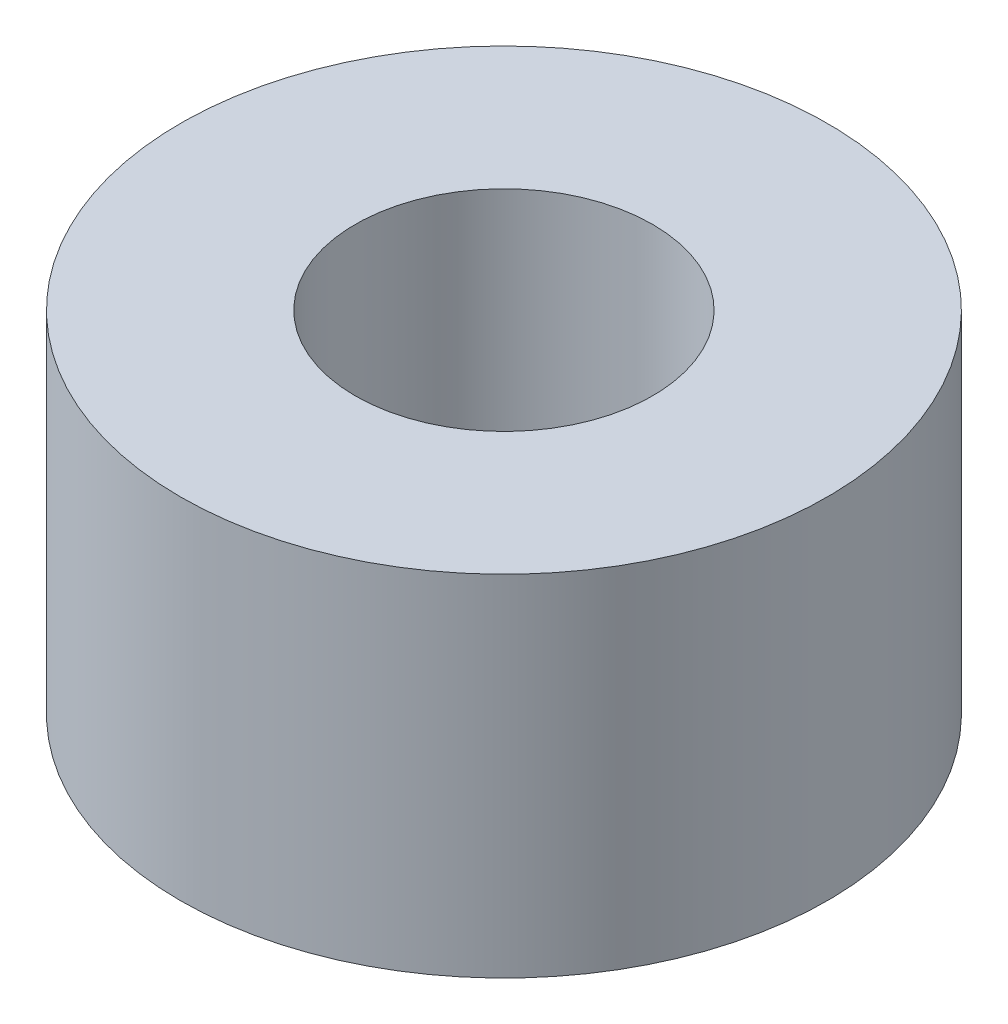
ISO-10303-21;
HEADER;
FILE_DESCRIPTION(('STEP AP214'),'2;1');
FILE_NAME('part.step','',(''),(''),'','','');
FILE_SCHEMA(('AUTOMOTIVE_DESIGN { 1 0 10303 214 1 1 1 1 }'));
ENDSEC;
DATA;
#1=APPLICATION_CONTEXT('core data for automotive mechanical design processes');
#2=APPLICATION_PROTOCOL_DEFINITION('international standard','automotive_design',2000,#1);
#3=PRODUCT_CONTEXT('',#1,'mechanical');
#4=PRODUCT('Part','Part','',(#3));
#5=PRODUCT_RELATED_PRODUCT_CATEGORY('part','',(#4));
#6=PRODUCT_DEFINITION_FORMATION('','',#4);
#7=PRODUCT_DEFINITION_CONTEXT('part definition',#1,'design');
#8=PRODUCT_DEFINITION('design','',#6,#7);
#9=PRODUCT_DEFINITION_SHAPE('','',#8);
#10=(LENGTH_UNIT() NAMED_UNIT(*) SI_UNIT(.MILLI.,.METRE.));
#11=(NAMED_UNIT(*) PLANE_ANGLE_UNIT() SI_UNIT($,.RADIAN.));
#12=(NAMED_UNIT(*) SI_UNIT($,.STERADIAN.) SOLID_ANGLE_UNIT());
#13=UNCERTAINTY_MEASURE_WITH_UNIT(LENGTH_MEASURE(1.E-05),#10,'distance_accuracy_value','');
#14=(GEOMETRIC_REPRESENTATION_CONTEXT(3) GLOBAL_UNCERTAINTY_ASSIGNED_CONTEXT((#13)) GLOBAL_UNIT_ASSIGNED_CONTEXT((#10,
#11,#12)) REPRESENTATION_CONTEXT('',''));
#15=CARTESIAN_POINT('',(0.,0.,0.));
#16=DIRECTION('',(0.,0.,1.));
#17=DIRECTION('',(1.,0.,0.));
#18=AXIS2_PLACEMENT_3D('',#15,#16,#17);
#19=CARTESIAN_POINT('',(0.,5.08,0.));
#20=DIRECTION('',(0.,1.,0.));
#21=DIRECTION('',(0.,0.,1.));
#22=AXIS2_PLACEMENT_3D('',#19,#20,#21);
#23=PLANE('',#22);
#24=CARTESIAN_POINT('',(0.,5.08,0.));
#25=DIRECTION('',(0.,1.,0.));
#26=DIRECTION('',(0.,0.,1.));
#27=AXIS2_PLACEMENT_3D('',#24,#25,#26);
#28=CIRCLE('',#27,4.699);
#29=CARTESIAN_POINT('',(0.,5.08,4.699));
#30=VERTEX_POINT('',#29);
#31=EDGE_CURVE('E10',#30,#30,#28,.T.);
#32=ORIENTED_EDGE('',*,*,#31,.T.);
#33=EDGE_LOOP('',(#32));
#34=FACE_BOUND('',#33,.T.);
#35=CARTESIAN_POINT('',(0.,5.08,0.));
#36=DIRECTION('',(0.,1.,0.));
#37=DIRECTION('',(0.,0.,1.));
#38=AXIS2_PLACEMENT_3D('',#35,#36,#37);
#39=CIRCLE('',#38,2.159);
#40=CARTESIAN_POINT('',(0.,5.08,2.159));
#41=VERTEX_POINT('',#40);
#42=EDGE_CURVE('E45',#41,#41,#39,.T.);
#43=ORIENTED_EDGE('',*,*,#42,.F.);
#44=EDGE_LOOP('',(#43));
#45=FACE_BOUND('',#44,.T.);
#46=ADVANCED_FACE('F34',(#34,#45),#23,.T.);
#47=CARTESIAN_POINT('',(0.,0.,0.));
#48=DIRECTION('',(0.,1.,0.));
#49=DIRECTION('',(0.,0.,1.));
#50=AXIS2_PLACEMENT_3D('',#47,#48,#49);
#51=PLANE('',#50);
#52=CARTESIAN_POINT('',(0.,0.,0.));
#53=DIRECTION('',(0.,1.,0.));
#54=DIRECTION('',(0.,0.,1.));
#55=AXIS2_PLACEMENT_3D('',#52,#53,#54);
#56=CIRCLE('',#55,4.699);
#57=CARTESIAN_POINT('',(0.,0.,4.699));
#58=VERTEX_POINT('',#57);
#59=EDGE_CURVE('E38',#58,#58,#56,.T.);
#60=ORIENTED_EDGE('',*,*,#59,.F.);
#61=EDGE_LOOP('',(#60));
#62=FACE_BOUND('',#61,.T.);
#63=CARTESIAN_POINT('',(0.,0.,0.));
#64=DIRECTION('',(0.,1.,0.));
#65=DIRECTION('',(0.,0.,1.));
#66=AXIS2_PLACEMENT_3D('',#63,#64,#65);
#67=CIRCLE('',#66,2.159);
#68=CARTESIAN_POINT('',(0.,0.,2.159));
#69=VERTEX_POINT('',#68);
#70=EDGE_CURVE('E47',#69,#69,#67,.T.);
#71=ORIENTED_EDGE('',*,*,#70,.T.);
#72=EDGE_LOOP('',(#71));
#73=FACE_BOUND('',#72,.T.);
#74=ADVANCED_FACE('F57',(#62,#73),#51,.F.);
#75=CARTESIAN_POINT('',(0.,5.08,0.));
#76=DIRECTION('',(0.,-1.,0.));
#77=DIRECTION('',(0.,0.,-1.));
#78=AXIS2_PLACEMENT_3D('',#75,#76,#77);
#79=CYLINDRICAL_SURFACE('',#78,4.699);
#80=ORIENTED_EDGE('',*,*,#31,.F.);
#81=EDGE_LOOP('',(#80));
#82=FACE_BOUND('',#81,.T.);
#83=ORIENTED_EDGE('',*,*,#59,.T.);
#84=EDGE_LOOP('',(#83));
#85=FACE_BOUND('',#84,.T.);
#86=ADVANCED_FACE('F36',(#82,#85),#79,.T.);
#87=CARTESIAN_POINT('',(0.,5.08,0.));
#88=DIRECTION('',(0.,-1.,0.));
#89=DIRECTION('',(0.,0.,-1.));
#90=AXIS2_PLACEMENT_3D('',#87,#88,#89);
#91=CYLINDRICAL_SURFACE('',#90,2.159);
#92=ORIENTED_EDGE('',*,*,#42,.T.);
#93=EDGE_LOOP('',(#92));
#94=FACE_BOUND('',#93,.T.);
#95=ORIENTED_EDGE('',*,*,#70,.F.);
#96=EDGE_LOOP('',(#95));
#97=FACE_BOUND('',#96,.T.);
#98=ADVANCED_FACE('F53',(#94,#97),#91,.F.);
#99=CLOSED_SHELL('',(#46,#74,#86,#98));
#100=MANIFOLD_SOLID_BREP('B2',#99);
#101=ADVANCED_BREP_SHAPE_REPRESENTATION('',(#18,#100),#14);
#102=SHAPE_DEFINITION_REPRESENTATION(#9,#101);
ENDSEC;
END-ISO-10303-21;
